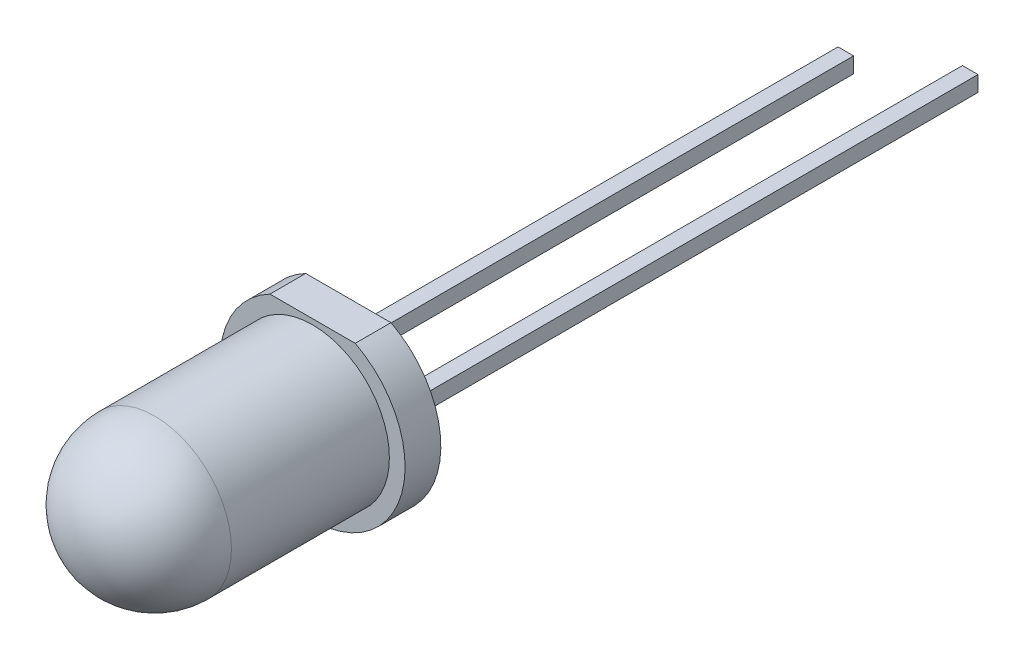
ISO-10303-21;
HEADER;
FILE_DESCRIPTION(('STEP AP214'),'2;1');
FILE_NAME('part.step','',(''),(''),'','','');
FILE_SCHEMA(('AUTOMOTIVE_DESIGN { 1 0 10303 214 1 1 1 1 }'));
ENDSEC;
DATA;
#1=APPLICATION_CONTEXT('core data for automotive mechanical design processes');
#2=APPLICATION_PROTOCOL_DEFINITION('international standard','automotive_design',2000,#1);
#3=PRODUCT_CONTEXT('',#1,'mechanical');
#4=PRODUCT('Part','Part','',(#3));
#5=PRODUCT_RELATED_PRODUCT_CATEGORY('part','',(#4));
#6=PRODUCT_DEFINITION_FORMATION('','',#4);
#7=PRODUCT_DEFINITION_CONTEXT('part definition',#1,'design');
#8=PRODUCT_DEFINITION('design','',#6,#7);
#9=PRODUCT_DEFINITION_SHAPE('','',#8);
#10=(LENGTH_UNIT() NAMED_UNIT(*) SI_UNIT(.MILLI.,.METRE.));
#11=(NAMED_UNIT(*) PLANE_ANGLE_UNIT() SI_UNIT($,.RADIAN.));
#12=(NAMED_UNIT(*) SI_UNIT($,.STERADIAN.) SOLID_ANGLE_UNIT());
#13=UNCERTAINTY_MEASURE_WITH_UNIT(LENGTH_MEASURE(1.E-05),#10,'distance_accuracy_value','');
#14=(GEOMETRIC_REPRESENTATION_CONTEXT(3) GLOBAL_UNCERTAINTY_ASSIGNED_CONTEXT((#13)) GLOBAL_UNIT_ASSIGNED_CONTEXT((#10,
#11,#12)) REPRESENTATION_CONTEXT('',''));
#15=CARTESIAN_POINT('',(0.,0.,0.));
#16=DIRECTION('',(0.,0.,1.));
#17=DIRECTION('',(1.,0.,0.));
#18=AXIS2_PLACEMENT_3D('',#15,#16,#17);
#19=CARTESIAN_POINT('',(0.25,1.51,-20.575));
#20=DIRECTION('',(-1.,0.,0.));
#21=DIRECTION('',(0.,-1.,0.));
#22=AXIS2_PLACEMENT_3D('',#19,#20,#21);
#23=PLANE('',#22);
#24=DIRECTION('',(0.,-1.,0.));
#25=VECTOR('',#24,1.);
#26=CARTESIAN_POINT('',(0.25,1.51,-16.575));
#27=LINE('',#26,#25);
#28=CARTESIAN_POINT('',(0.25,1.51,-16.575));
#29=VERTEX_POINT('',#28);
#30=CARTESIAN_POINT('',(0.25,1.01,-16.575));
#31=VERTEX_POINT('',#30);
#32=EDGE_CURVE('E108',#29,#31,#27,.T.);
#33=ORIENTED_EDGE('',*,*,#32,.F.);
#34=DIRECTION('',(0.,0.,1.));
#35=VECTOR('',#34,1.);
#36=CARTESIAN_POINT('',(0.25,1.51,-20.575));
#37=LINE('',#36,#35);
#38=CARTESIAN_POINT('',(0.25,1.51,-0.575));
#39=VERTEX_POINT('',#38);
#40=EDGE_CURVE('E236',#29,#39,#37,.T.);
#41=ORIENTED_EDGE('',*,*,#40,.T.);
#42=DIRECTION('',(0.,-1.,0.));
#43=VECTOR('',#42,1.);
#44=CARTESIAN_POINT('',(0.25,1.51,-0.575));
#45=LINE('',#44,#43);
#46=CARTESIAN_POINT('',(0.25,1.01,-0.575));
#47=VERTEX_POINT('',#46);
#48=EDGE_CURVE('E127',#39,#47,#45,.T.);
#49=ORIENTED_EDGE('',*,*,#48,.T.);
#50=DIRECTION('',(0.,0.,1.));
#51=VECTOR('',#50,1.);
#52=CARTESIAN_POINT('',(0.25,1.01,-20.575));
#53=LINE('',#52,#51);
#54=EDGE_CURVE('E121',#31,#47,#53,.T.);
#55=ORIENTED_EDGE('',*,*,#54,.F.);
#56=EDGE_LOOP('',(#33,#41,#49,#55));
#57=FACE_BOUND('',#56,.T.);
#58=ADVANCED_FACE('F34',(#57),#23,.F.);
#59=CARTESIAN_POINT('',(0.25,1.01,-20.575));
#60=DIRECTION('',(0.,1.,0.));
#61=DIRECTION('',(0.,0.,1.));
#62=AXIS2_PLACEMENT_3D('',#59,#60,#61);
#63=PLANE('',#62);
#64=DIRECTION('',(-1.,0.,0.));
#65=VECTOR('',#64,1.);
#66=CARTESIAN_POINT('',(0.25,1.01,-16.575));
#67=LINE('',#66,#65);
#68=CARTESIAN_POINT('',(-0.25,1.01,-16.575));
#69=VERTEX_POINT('',#68);
#70=EDGE_CURVE('E111',#31,#69,#67,.T.);
#71=ORIENTED_EDGE('',*,*,#70,.F.);
#72=ORIENTED_EDGE('',*,*,#54,.T.);
#73=DIRECTION('',(-1.,0.,0.));
#74=VECTOR('',#73,1.);
#75=CARTESIAN_POINT('',(0.25,1.01,-0.575));
#76=LINE('',#75,#74);
#77=CARTESIAN_POINT('',(-0.25,1.01,-0.575));
#78=VERTEX_POINT('',#77);
#79=EDGE_CURVE('E228',#47,#78,#76,.T.);
#80=ORIENTED_EDGE('',*,*,#79,.T.);
#81=DIRECTION('',(0.,0.,1.));
#82=VECTOR('',#81,1.);
#83=CARTESIAN_POINT('',(-0.25,1.01,-20.575));
#84=LINE('',#83,#82);
#85=EDGE_CURVE('E123',#69,#78,#84,.T.);
#86=ORIENTED_EDGE('',*,*,#85,.F.);
#87=EDGE_LOOP('',(#71,#72,#80,#86));
#88=FACE_BOUND('',#87,.T.);
#89=ADVANCED_FACE('F119',(#88),#63,.F.);
#90=CARTESIAN_POINT('',(-0.25,1.51,-20.575));
#91=DIRECTION('',(1.,0.,0.));
#92=DIRECTION('',(0.,1.,0.));
#93=AXIS2_PLACEMENT_3D('',#90,#91,#92);
#94=PLANE('',#93);
#95=DIRECTION('',(0.,1.,0.));
#96=VECTOR('',#95,1.);
#97=CARTESIAN_POINT('',(-0.25,1.51,-16.575));
#98=LINE('',#97,#96);
#99=CARTESIAN_POINT('',(-0.25,1.51,-16.575));
#100=VERTEX_POINT('',#99);
#101=EDGE_CURVE('E49',#69,#100,#98,.T.);
#102=ORIENTED_EDGE('',*,*,#101,.F.);
#103=ORIENTED_EDGE('',*,*,#85,.T.);
#104=DIRECTION('',(0.,1.,0.));
#105=VECTOR('',#104,1.);
#106=CARTESIAN_POINT('',(-0.25,1.51,-0.575));
#107=LINE('',#106,#105);
#108=CARTESIAN_POINT('',(-0.25,1.51,-0.575));
#109=VERTEX_POINT('',#108);
#110=EDGE_CURVE('E230',#78,#109,#107,.T.);
#111=ORIENTED_EDGE('',*,*,#110,.T.);
#112=DIRECTION('',(0.,0.,1.));
#113=VECTOR('',#112,1.);
#114=CARTESIAN_POINT('',(-0.25,1.51,-20.575));
#115=LINE('',#114,#113);
#116=EDGE_CURVE('E132',#100,#109,#115,.T.);
#117=ORIENTED_EDGE('',*,*,#116,.F.);
#118=EDGE_LOOP('',(#102,#103,#111,#117));
#119=FACE_BOUND('',#118,.T.);
#120=ADVANCED_FACE('F170',(#119),#94,.F.);
#121=CARTESIAN_POINT('',(0.25,1.51,-20.575));
#122=DIRECTION('',(0.,-1.,0.));
#123=DIRECTION('',(0.,0.,-1.));
#124=AXIS2_PLACEMENT_3D('',#121,#122,#123);
#125=PLANE('',#124);
#126=DIRECTION('',(1.,0.,0.));
#127=VECTOR('',#126,1.);
#128=CARTESIAN_POINT('',(0.25,1.51,-16.575));
#129=LINE('',#128,#127);
#130=EDGE_CURVE('E112',#100,#29,#129,.T.);
#131=ORIENTED_EDGE('',*,*,#130,.F.);
#132=ORIENTED_EDGE('',*,*,#116,.T.);
#133=DIRECTION('',(1.,0.,0.));
#134=VECTOR('',#133,1.);
#135=CARTESIAN_POINT('',(0.25,1.51,-0.575));
#136=LINE('',#135,#134);
#137=EDGE_CURVE('E233',#109,#39,#136,.T.);
#138=ORIENTED_EDGE('',*,*,#137,.T.);
#139=ORIENTED_EDGE('',*,*,#40,.F.);
#140=EDGE_LOOP('',(#131,#132,#138,#139));
#141=FACE_BOUND('',#140,.T.);
#142=ADVANCED_FACE('F180',(#141),#125,.F.);
#143=CARTESIAN_POINT('',(0.,0.,-0.575));
#144=DIRECTION('',(0.,0.,1.));
#145=DIRECTION('',(1.,0.,0.));
#146=AXIS2_PLACEMENT_3D('',#143,#144,#145);
#147=PLANE('',#146);
#148=ORIENTED_EDGE('',*,*,#48,.F.);
#149=ORIENTED_EDGE('',*,*,#137,.F.);
#150=ORIENTED_EDGE('',*,*,#110,.F.);
#151=ORIENTED_EDGE('',*,*,#79,.F.);
#152=EDGE_LOOP('',(#148,#149,#150,#151));
#153=FACE_BOUND('',#152,.T.);
#154=DIRECTION('',(-1.,0.,0.));
#155=VECTOR('',#154,1.);
#156=CARTESIAN_POINT('',(0.,2.64,-0.575));
#157=LINE('',#156,#155);
#158=CARTESIAN_POINT('',(1.37150464818753,2.64,-0.575));
#159=VERTEX_POINT('',#158);
#160=CARTESIAN_POINT('',(-1.37150464818753,2.64,-0.575));
#161=VERTEX_POINT('',#160);
#162=EDGE_CURVE('E11',#159,#161,#157,.T.);
#163=ORIENTED_EDGE('',*,*,#162,.F.);
#164=CARTESIAN_POINT('',(0.,0.,-0.575));
#165=DIRECTION('',(0.,0.,1.));
#166=DIRECTION('',(1.,0.,0.));
#167=AXIS2_PLACEMENT_3D('',#164,#165,#166);
#168=CIRCLE('',#167,2.975);
#169=EDGE_CURVE('E143',#161,#159,#168,.T.);
#170=ORIENTED_EDGE('',*,*,#169,.F.);
#171=EDGE_LOOP('',(#163,#170));
#172=FACE_BOUND('',#171,.T.);
#173=DIRECTION('',(0.,-1.,0.));
#174=VECTOR('',#173,1.);
#175=CARTESIAN_POINT('',(0.25,-1.01,-0.575));
#176=LINE('',#175,#174);
#177=CARTESIAN_POINT('',(0.25,-1.01,-0.575));
#178=VERTEX_POINT('',#177);
#179=CARTESIAN_POINT('',(0.25,-1.51,-0.575));
#180=VERTEX_POINT('',#179);
#181=EDGE_CURVE('E194',#178,#180,#176,.T.);
#182=ORIENTED_EDGE('',*,*,#181,.F.);
#183=DIRECTION('',(1.,0.,0.));
#184=VECTOR('',#183,1.);
#185=CARTESIAN_POINT('',(0.25,-1.01,-0.575));
#186=LINE('',#185,#184);
#187=CARTESIAN_POINT('',(-0.25,-1.01,-0.575));
#188=VERTEX_POINT('',#187);
#189=EDGE_CURVE('E196',#188,#178,#186,.T.);
#190=ORIENTED_EDGE('',*,*,#189,.F.);
#191=DIRECTION('',(0.,1.,0.));
#192=VECTOR('',#191,1.);
#193=CARTESIAN_POINT('',(-0.25,-1.01,-0.575));
#194=LINE('',#193,#192);
#195=CARTESIAN_POINT('',(-0.25,-1.51,-0.575));
#196=VERTEX_POINT('',#195);
#197=EDGE_CURVE('E212',#196,#188,#194,.T.);
#198=ORIENTED_EDGE('',*,*,#197,.F.);
#199=DIRECTION('',(-1.,0.,0.));
#200=VECTOR('',#199,1.);
#201=CARTESIAN_POINT('',(0.25,-1.51,-0.575));
#202=LINE('',#201,#200);
#203=EDGE_CURVE('E57',#180,#196,#202,.T.);
#204=ORIENTED_EDGE('',*,*,#203,.F.);
#205=EDGE_LOOP('',(#182,#190,#198,#204));
#206=FACE_BOUND('',#205,.T.);
#207=ADVANCED_FACE('F177',(#153,#172,#206),#147,.F.);
#208=CARTESIAN_POINT('',(0.,0.,0.575));
#209=DIRECTION('',(0.,0.,1.));
#210=DIRECTION('',(1.,0.,0.));
#211=AXIS2_PLACEMENT_3D('',#208,#209,#210);
#212=PLANE('',#211);
#213=CARTESIAN_POINT('',(0.,0.,0.575));
#214=DIRECTION('',(0.,0.,1.));
#215=DIRECTION('',(1.,0.,0.));
#216=AXIS2_PLACEMENT_3D('',#213,#214,#215);
#217=CIRCLE('',#216,2.47);
#218=CARTESIAN_POINT('',(2.47,0.,0.575));
#219=VERTEX_POINT('',#218);
#220=EDGE_CURVE('E140',#219,#219,#217,.T.);
#221=ORIENTED_EDGE('',*,*,#220,.F.);
#222=EDGE_LOOP('',(#221));
#223=FACE_BOUND('',#222,.T.);
#224=CARTESIAN_POINT('',(0.,0.,0.575));
#225=DIRECTION('',(0.,0.,1.));
#226=DIRECTION('',(1.,0.,0.));
#227=AXIS2_PLACEMENT_3D('',#224,#225,#226);
#228=CIRCLE('',#227,2.975);
#229=CARTESIAN_POINT('',(-1.37150464818753,2.64,0.575));
#230=VERTEX_POINT('',#229);
#231=CARTESIAN_POINT('',(1.37150464818753,2.64,0.575));
#232=VERTEX_POINT('',#231);
#233=EDGE_CURVE('E144',#230,#232,#228,.T.);
#234=ORIENTED_EDGE('',*,*,#233,.T.);
#235=DIRECTION('',(-1.,0.,0.));
#236=VECTOR('',#235,1.);
#237=CARTESIAN_POINT('',(0.,2.64,0.575));
#238=LINE('',#237,#236);
#239=EDGE_CURVE('E137',#232,#230,#238,.T.);
#240=ORIENTED_EDGE('',*,*,#239,.T.);
#241=EDGE_LOOP('',(#234,#240));
#242=FACE_BOUND('',#241,.T.);
#243=ADVANCED_FACE('F174',(#223,#242),#212,.T.);
#244=CARTESIAN_POINT('',(0.,0.,0.575));
#245=DIRECTION('',(0.,0.,-1.));
#246=DIRECTION('',(-1.,0.,0.));
#247=AXIS2_PLACEMENT_3D('',#244,#245,#246);
#248=CYLINDRICAL_SURFACE('',#247,2.975);
#249=DIRECTION('',(0.,0.,-1.));
#250=VECTOR('',#249,1.);
#251=CARTESIAN_POINT('',(1.37150464818753,2.64,0.575));
#252=LINE('',#251,#250);
#253=EDGE_CURVE('E130',#232,#159,#252,.T.);
#254=ORIENTED_EDGE('',*,*,#253,.F.);
#255=ORIENTED_EDGE('',*,*,#233,.F.);
#256=DIRECTION('',(0.,0.,-1.));
#257=VECTOR('',#256,1.);
#258=CARTESIAN_POINT('',(-1.37150464818753,2.64,0.575));
#259=LINE('',#258,#257);
#260=EDGE_CURVE('E128',#161,#230,#259,.F.);
#261=ORIENTED_EDGE('',*,*,#260,.F.);
#262=ORIENTED_EDGE('',*,*,#169,.T.);
#263=EDGE_LOOP('',(#254,#255,#261,#262));
#264=FACE_BOUND('',#263,.T.);
#265=ADVANCED_FACE('F163',(#264),#248,.T.);
#266=CARTESIAN_POINT('',(0.,0.,8.125));
#267=DIRECTION('',(0.,0.,-1.));
#268=DIRECTION('',(-1.,0.,0.));
#269=AXIS2_PLACEMENT_3D('',#266,#267,#268);
#270=CYLINDRICAL_SURFACE('',#269,2.47);
#271=CARTESIAN_POINT('',(0.,0.,5.655));
#272=DIRECTION('',(0.,0.,-1.));
#273=DIRECTION('',(-1.,0.,0.));
#274=AXIS2_PLACEMENT_3D('',#271,#272,#273);
#275=CIRCLE('',#274,2.47);
#276=CARTESIAN_POINT('',(-2.47,0.,5.655));
#277=VERTEX_POINT('',#276);
#278=EDGE_CURVE('E42',#277,#277,#275,.T.);
#279=ORIENTED_EDGE('',*,*,#278,.T.);
#280=EDGE_LOOP('',(#279));
#281=FACE_BOUND('',#280,.T.);
#282=ORIENTED_EDGE('',*,*,#220,.T.);
#283=EDGE_LOOP('',(#282));
#284=FACE_BOUND('',#283,.T.);
#285=ADVANCED_FACE('F151',(#281,#284),#270,.T.);
#286=CARTESIAN_POINT('',(0.,0.,5.655));
#287=DIRECTION('',(0.,0.,1.));
#288=DIRECTION('',(1.,0.,0.));
#289=AXIS2_PLACEMENT_3D('',#286,#287,#288);
#290=SPHERICAL_SURFACE('',#289,2.47);
#291=ORIENTED_EDGE('',*,*,#278,.F.);
#292=EDGE_LOOP('',(#291));
#293=FACE_BOUND('',#292,.T.);
#294=ADVANCED_FACE('F36',(#293),#290,.T.);
#295=CARTESIAN_POINT('',(-4.59893373624709,2.64,3.07803442353816));
#296=DIRECTION('',(0.,1.,0.));
#297=DIRECTION('',(0.,0.,1.));
#298=AXIS2_PLACEMENT_3D('',#295,#296,#297);
#299=PLANE('',#298);
#300=ORIENTED_EDGE('',*,*,#253,.T.);
#301=ORIENTED_EDGE('',*,*,#162,.T.);
#302=ORIENTED_EDGE('',*,*,#260,.T.);
#303=ORIENTED_EDGE('',*,*,#239,.F.);
#304=EDGE_LOOP('',(#300,#301,#302,#303));
#305=FACE_BOUND('',#304,.T.);
#306=ADVANCED_FACE('F155',(#305),#299,.T.);
#307=CARTESIAN_POINT('',(0.25,-1.01,-20.575));
#308=DIRECTION('',(-1.,0.,0.));
#309=DIRECTION('',(0.,-1.,0.));
#310=AXIS2_PLACEMENT_3D('',#307,#308,#309);
#311=PLANE('',#310);
#312=ORIENTED_EDGE('',*,*,#181,.T.);
#313=DIRECTION('',(0.,0.,1.));
#314=VECTOR('',#313,1.);
#315=CARTESIAN_POINT('',(0.25,-1.51,-20.575));
#316=LINE('',#315,#314);
#317=CARTESIAN_POINT('',(0.25,-1.51,-20.575));
#318=VERTEX_POINT('',#317);
#319=EDGE_CURVE('E225',#318,#180,#316,.T.);
#320=ORIENTED_EDGE('',*,*,#319,.F.);
#321=DIRECTION('',(0.,-1.,0.));
#322=VECTOR('',#321,1.);
#323=CARTESIAN_POINT('',(0.25,-1.01,-20.575));
#324=LINE('',#323,#322);
#325=CARTESIAN_POINT('',(0.25,-1.01,-20.575));
#326=VERTEX_POINT('',#325);
#327=EDGE_CURVE('E211',#326,#318,#324,.T.);
#328=ORIENTED_EDGE('',*,*,#327,.F.);
#329=DIRECTION('',(0.,0.,1.));
#330=VECTOR('',#329,1.);
#331=CARTESIAN_POINT('',(0.25,-1.01,-20.575));
#332=LINE('',#331,#330);
#333=EDGE_CURVE('E207',#326,#178,#332,.T.);
#334=ORIENTED_EDGE('',*,*,#333,.T.);
#335=EDGE_LOOP('',(#312,#320,#328,#334));
#336=FACE_BOUND('',#335,.T.);
#337=ADVANCED_FACE('F160',(#336),#311,.F.);
#338=CARTESIAN_POINT('',(0.25,-1.51,-20.575));
#339=DIRECTION('',(0.,1.,0.));
#340=DIRECTION('',(0.,0.,1.));
#341=AXIS2_PLACEMENT_3D('',#338,#339,#340);
#342=PLANE('',#341);
#343=ORIENTED_EDGE('',*,*,#203,.T.);
#344=DIRECTION('',(0.,0.,1.));
#345=VECTOR('',#344,1.);
#346=CARTESIAN_POINT('',(-0.25,-1.51,-20.575));
#347=LINE('',#346,#345);
#348=CARTESIAN_POINT('',(-0.25,-1.51,-20.575));
#349=VERTEX_POINT('',#348);
#350=EDGE_CURVE('E217',#349,#196,#347,.T.);
#351=ORIENTED_EDGE('',*,*,#350,.F.);
#352=DIRECTION('',(-1.,0.,0.));
#353=VECTOR('',#352,1.);
#354=CARTESIAN_POINT('',(0.25,-1.51,-20.575));
#355=LINE('',#354,#353);
#356=EDGE_CURVE('E246',#318,#349,#355,.T.);
#357=ORIENTED_EDGE('',*,*,#356,.F.);
#358=ORIENTED_EDGE('',*,*,#319,.T.);
#359=EDGE_LOOP('',(#343,#351,#357,#358));
#360=FACE_BOUND('',#359,.T.);
#361=ADVANCED_FACE('F254',(#360),#342,.F.);
#362=CARTESIAN_POINT('',(-0.25,-1.01,-20.575));
#363=DIRECTION('',(1.,0.,0.));
#364=DIRECTION('',(0.,1.,0.));
#365=AXIS2_PLACEMENT_3D('',#362,#363,#364);
#366=PLANE('',#365);
#367=ORIENTED_EDGE('',*,*,#197,.T.);
#368=DIRECTION('',(0.,0.,1.));
#369=VECTOR('',#368,1.);
#370=CARTESIAN_POINT('',(-0.25,-1.01,-20.575));
#371=LINE('',#370,#369);
#372=CARTESIAN_POINT('',(-0.25,-1.01,-20.575));
#373=VERTEX_POINT('',#372);
#374=EDGE_CURVE('E210',#373,#188,#371,.T.);
#375=ORIENTED_EDGE('',*,*,#374,.F.);
#376=DIRECTION('',(0.,1.,0.));
#377=VECTOR('',#376,1.);
#378=CARTESIAN_POINT('',(-0.25,-1.01,-20.575));
#379=LINE('',#378,#377);
#380=EDGE_CURVE('E219',#349,#373,#379,.T.);
#381=ORIENTED_EDGE('',*,*,#380,.F.);
#382=ORIENTED_EDGE('',*,*,#350,.T.);
#383=EDGE_LOOP('',(#367,#375,#381,#382));
#384=FACE_BOUND('',#383,.T.);
#385=ADVANCED_FACE('F250',(#384),#366,.F.);
#386=CARTESIAN_POINT('',(0.25,-1.01,-20.575));
#387=DIRECTION('',(0.,-1.,0.));
#388=DIRECTION('',(1.,0.,0.));
#389=AXIS2_PLACEMENT_3D('',#386,#387,#388);
#390=PLANE('',#389);
#391=ORIENTED_EDGE('',*,*,#189,.T.);
#392=ORIENTED_EDGE('',*,*,#333,.F.);
#393=DIRECTION('',(1.,0.,0.));
#394=VECTOR('',#393,1.);
#395=CARTESIAN_POINT('',(0.25,-1.01,-20.575));
#396=LINE('',#395,#394);
#397=EDGE_CURVE('E215',#373,#326,#396,.T.);
#398=ORIENTED_EDGE('',*,*,#397,.F.);
#399=ORIENTED_EDGE('',*,*,#374,.T.);
#400=EDGE_LOOP('',(#391,#392,#398,#399));
#401=FACE_BOUND('',#400,.T.);
#402=ADVANCED_FACE('F205',(#401),#390,.F.);
#403=CARTESIAN_POINT('',(0.25,-1.51,-20.575));
#404=DIRECTION('',(0.,0.,-1.));
#405=DIRECTION('',(-1.,0.,0.));
#406=AXIS2_PLACEMENT_3D('',#403,#404,#405);
#407=PLANE('',#406);
#408=ORIENTED_EDGE('',*,*,#327,.T.);
#409=ORIENTED_EDGE('',*,*,#356,.T.);
#410=ORIENTED_EDGE('',*,*,#380,.T.);
#411=ORIENTED_EDGE('',*,*,#397,.T.);
#412=EDGE_LOOP('',(#408,#409,#410,#411));
#413=FACE_BOUND('',#412,.T.);
#414=ADVANCED_FACE('F256',(#413),#407,.T.);
#415=CARTESIAN_POINT('',(0.25,1.01,-16.575));
#416=DIRECTION('',(0.,0.,-1.));
#417=DIRECTION('',(-1.,0.,0.));
#418=AXIS2_PLACEMENT_3D('',#415,#416,#417);
#419=PLANE('',#418);
#420=ORIENTED_EDGE('',*,*,#32,.T.);
#421=ORIENTED_EDGE('',*,*,#70,.T.);
#422=ORIENTED_EDGE('',*,*,#101,.T.);
#423=ORIENTED_EDGE('',*,*,#130,.T.);
#424=EDGE_LOOP('',(#420,#421,#422,#423));
#425=FACE_BOUND('',#424,.T.);
#426=ADVANCED_FACE('F110',(#425),#419,.T.);
#427=CLOSED_SHELL('',(#58,#89,#120,#142,#207,#243,#265,#285,#294,#306,#337,#361,#385,#402,#414,#426));
#428=MANIFOLD_SOLID_BREP('B2',#427);
#429=ADVANCED_BREP_SHAPE_REPRESENTATION('',(#18,#428),#14);
#430=SHAPE_DEFINITION_REPRESENTATION(#9,#429);
ENDSEC;
END-ISO-10303-21;
